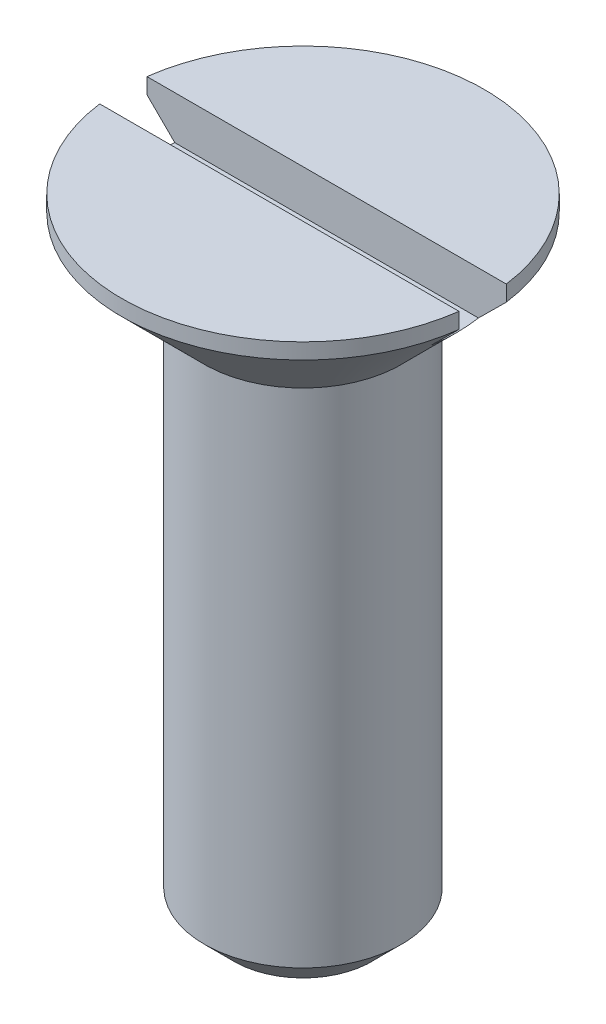
ISO-10303-21;
HEADER;
FILE_DESCRIPTION(('STEP AP214'),'2;1');
FILE_NAME('part.step','',(''),(''),'','','');
FILE_SCHEMA(('AUTOMOTIVE_DESIGN { 1 0 10303 214 1 1 1 1 }'));
ENDSEC;
DATA;
#1=APPLICATION_CONTEXT('core data for automotive mechanical design processes');
#2=APPLICATION_PROTOCOL_DEFINITION('international standard','automotive_design',2000,#1);
#3=PRODUCT_CONTEXT('',#1,'mechanical');
#4=PRODUCT('Part','Part','',(#3));
#5=PRODUCT_RELATED_PRODUCT_CATEGORY('part','',(#4));
#6=PRODUCT_DEFINITION_FORMATION('','',#4);
#7=PRODUCT_DEFINITION_CONTEXT('part definition',#1,'design');
#8=PRODUCT_DEFINITION('design','',#6,#7);
#9=PRODUCT_DEFINITION_SHAPE('','',#8);
#10=(LENGTH_UNIT() NAMED_UNIT(*) SI_UNIT(.MILLI.,.METRE.));
#11=(NAMED_UNIT(*) PLANE_ANGLE_UNIT() SI_UNIT($,.RADIAN.));
#12=(NAMED_UNIT(*) SI_UNIT($,.STERADIAN.) SOLID_ANGLE_UNIT());
#13=UNCERTAINTY_MEASURE_WITH_UNIT(LENGTH_MEASURE(1.E-05),#10,'distance_accuracy_value','');
#14=(GEOMETRIC_REPRESENTATION_CONTEXT(3) GLOBAL_UNCERTAINTY_ASSIGNED_CONTEXT((#13)) GLOBAL_UNIT_ASSIGNED_CONTEXT((#10,
#11,#12)) REPRESENTATION_CONTEXT('',''));
#15=CARTESIAN_POINT('',(0.,0.,0.));
#16=DIRECTION('',(0.,0.,1.));
#17=DIRECTION('',(1.,0.,0.));
#18=AXIS2_PLACEMENT_3D('',#15,#16,#17);
#19=CARTESIAN_POINT('',(0.,125.763182897862,0.));
#20=DIRECTION('',(0.,1.,0.));
#21=DIRECTION('',(-1.,0.,0.));
#22=AXIS2_PLACEMENT_3D('',#19,#20,#21);
#23=CYLINDRICAL_SURFACE('',#22,4.59999999999999);
#24=CARTESIAN_POINT('',(0.,15.6,0.));
#25=DIRECTION('',(0.,1.,0.));
#26=DIRECTION('',(-1.,0.,0.));
#27=AXIS2_PLACEMENT_3D('',#24,#25,#26);
#28=CIRCLE('',#27,4.59999999999999);
#29=CARTESIAN_POINT('',(4.56070170039654,15.6,-0.600000000000001));
#30=VERTEX_POINT('',#29);
#31=CARTESIAN_POINT('',(-4.56070170039655,15.6,-0.599999999999999));
#32=VERTEX_POINT('',#31);
#33=EDGE_CURVE('E101',#30,#32,#28,.T.);
#34=ORIENTED_EDGE('',*,*,#33,.T.);
#35=DIRECTION('',(0.,1.,0.));
#36=VECTOR('',#35,1.);
#37=CARTESIAN_POINT('',(-4.56070170039655,125.763182897862,-0.599999999999999));
#38=LINE('',#37,#36);
#39=CARTESIAN_POINT('',(-4.56070170039655,16.,-0.599999999999999));
#40=VERTEX_POINT('',#39);
#41=EDGE_CURVE('E52',#32,#40,#38,.T.);
#42=ORIENTED_EDGE('',*,*,#41,.T.);
#43=CARTESIAN_POINT('',(0.,16.,0.));
#44=DIRECTION('',(0.,1.,0.));
#45=DIRECTION('',(-1.,0.,0.));
#46=AXIS2_PLACEMENT_3D('',#43,#44,#45);
#47=CIRCLE('',#46,4.59999999999999);
#48=CARTESIAN_POINT('',(4.56070170039654,16.,-0.600000000000001));
#49=VERTEX_POINT('',#48);
#50=EDGE_CURVE('E102',#49,#40,#47,.T.);
#51=ORIENTED_EDGE('',*,*,#50,.F.);
#52=DIRECTION('',(0.,1.,0.));
#53=VECTOR('',#52,1.);
#54=CARTESIAN_POINT('',(4.56070170039653,125.763182897862,-0.600000000000001));
#55=LINE('',#54,#53);
#56=EDGE_CURVE('E138',#49,#30,#55,.F.);
#57=ORIENTED_EDGE('',*,*,#56,.T.);
#58=EDGE_LOOP('',(#34,#42,#51,#57));
#59=FACE_BOUND('',#58,.T.);
#60=ADVANCED_FACE('F29',(#59),#23,.T.);
#61=CARTESIAN_POINT('',(0.,16.,0.));
#62=DIRECTION('',(0.,-1.,0.));
#63=DIRECTION('',(1.,0.,0.));
#64=AXIS2_PLACEMENT_3D('',#61,#62,#63);
#65=PLANE('',#64);
#66=ORIENTED_EDGE('',*,*,#50,.T.);
#67=DIRECTION('',(1.,0.,0.));
#68=VECTOR('',#67,1.);
#69=CARTESIAN_POINT('',(0.,16.,-0.6));
#70=LINE('',#69,#68);
#71=EDGE_CURVE('E88',#40,#49,#70,.T.);
#72=ORIENTED_EDGE('',*,*,#71,.T.);
#73=EDGE_LOOP('',(#66,#72));
#74=FACE_BOUND('',#73,.T.);
#75=ADVANCED_FACE('F149',(#74),#65,.F.);
#76=CARTESIAN_POINT('',(2.49999999999999,0.,0.));
#77=DIRECTION('',(0.,1.,0.));
#78=DIRECTION('',(-1.,0.,0.));
#79=AXIS2_PLACEMENT_3D('',#76,#77,#78);
#80=PLANE('',#79);
#81=CARTESIAN_POINT('',(0.,0.,0.));
#82=DIRECTION('',(0.,1.,0.));
#83=DIRECTION('',(-1.,0.,0.));
#84=AXIS2_PLACEMENT_3D('',#81,#82,#83);
#85=CIRCLE('',#84,1.75);
#86=CARTESIAN_POINT('',(-1.75,0.,0.));
#87=VERTEX_POINT('',#86);
#88=EDGE_CURVE('E11',#87,#87,#85,.F.);
#89=ORIENTED_EDGE('',*,*,#88,.T.);
#90=EDGE_LOOP('',(#89));
#91=FACE_BOUND('',#90,.T.);
#92=ADVANCED_FACE('F31',(#91),#80,.F.);
#93=CARTESIAN_POINT('',(0.,125.763182897862,0.));
#94=DIRECTION('',(0.,1.,0.));
#95=DIRECTION('',(-1.,0.,0.));
#96=AXIS2_PLACEMENT_3D('',#93,#94,#95);
#97=CYLINDRICAL_SURFACE('',#96,2.5);
#98=CARTESIAN_POINT('',(0.,0.750000000000001,0.));
#99=DIRECTION('',(0.,1.,0.));
#100=DIRECTION('',(-1.,0.,0.));
#101=AXIS2_PLACEMENT_3D('',#98,#99,#100);
#102=CIRCLE('',#101,2.5);
#103=CARTESIAN_POINT('',(-2.5,0.75,0.));
#104=VERTEX_POINT('',#103);
#105=EDGE_CURVE('E37',#104,#104,#102,.T.);
#106=ORIENTED_EDGE('',*,*,#105,.T.);
#107=EDGE_LOOP('',(#106));
#108=FACE_BOUND('',#107,.T.);
#109=CARTESIAN_POINT('',(0.,13.5,0.));
#110=DIRECTION('',(0.,1.,0.));
#111=DIRECTION('',(-1.,0.,0.));
#112=AXIS2_PLACEMENT_3D('',#109,#110,#111);
#113=CIRCLE('',#112,2.50000000000001);
#114=CARTESIAN_POINT('',(-2.50000000000001,13.5,0.));
#115=VERTEX_POINT('',#114);
#116=EDGE_CURVE('E89',#115,#115,#113,.T.);
#117=ORIENTED_EDGE('',*,*,#116,.F.);
#118=EDGE_LOOP('',(#117));
#119=FACE_BOUND('',#118,.T.);
#120=ADVANCED_FACE('F157',(#108,#119),#97,.T.);
#121=CARTESIAN_POINT('',(0.,13.5,0.));
#122=DIRECTION('',(0.,1.,0.));
#123=DIRECTION('',(-1.,0.,0.));
#124=AXIS2_PLACEMENT_3D('',#121,#122,#123);
#125=CONICAL_SURFACE('',#124,2.50000000000001,0.785398163397447);
#126=ORIENTED_EDGE('',*,*,#33,.F.);
#127=CARTESIAN_POINT('',(10.1183814062173,21.1361552021309,-0.600000000000001));
#128=CARTESIAN_POINT('',(9.77237880412525,20.7907639678698,-0.600000000000001));
#129=CARTESIAN_POINT('',(9.42634955709613,20.4453994117717,-0.600000000000001));
#130=CARTESIAN_POINT('',(8.73419947980485,19.7547528216736,-0.600000000000001));
#131=CARTESIAN_POINT('',(8.38807864837897,19.4094707888397,-0.600000000000001));
#132=CARTESIAN_POINT('',(7.69561256912965,18.718924146203,-0.600000000000001));
#133=CARTESIAN_POINT('',(7.34926728513484,18.3736595726667,-0.600000000000001));
#134=CARTESIAN_POINT('',(6.6563976764415,17.6833191573215,-0.600000000000001));
#135=CARTESIAN_POINT('',(6.30987335413859,17.3382433131082,-0.600000000000001));
#136=CARTESIAN_POINT('',(5.60826287125322,16.6401526146392,-0.600000000000001));
#137=CARTESIAN_POINT('',(5.25316970822671,16.2871447944795,-0.600000000000001));
#138=CARTESIAN_POINT('',(4.72010881260147,15.7580428202624,-0.600000000000001));
#139=CARTESIAN_POINT('',(4.54234803292822,15.5817402037148,-0.600000000000001));
#140=CARTESIAN_POINT('',(4.18662953547045,15.2293351784177,-0.600000000000001));
#141=CARTESIAN_POINT('',(4.00867181849116,15.0532327688557,-0.6));
#142=CARTESIAN_POINT('',(3.6525022761017,14.701352230337,-0.6));
#143=CARTESIAN_POINT('',(3.47429050503802,14.5255740464114,-0.6));
#144=CARTESIAN_POINT('',(3.11741605694822,14.1744703862123,-0.6));
#145=CARTESIAN_POINT('',(2.93875337293157,13.9991449170436,-0.6));
#146=CARTESIAN_POINT('',(2.58070617190923,13.6492560667098,-0.6));
#147=CARTESIAN_POINT('',(2.40132170753325,13.4746926318479,-0.6));
#148=CARTESIAN_POINT('',(2.13120273030563,13.2139309745137,-0.6));
#149=CARTESIAN_POINT('',(2.04099050490045,13.1271920943271,-0.6));
#150=CARTESIAN_POINT('',(1.86005552948668,12.9542488475986,-0.6));
#151=CARTESIAN_POINT('',(1.76933278423142,12.8680444760957,-0.6));
#152=CARTESIAN_POINT('',(1.62900147259109,12.7359075445599,-0.6));
#153=CARTESIAN_POINT('',(1.57966840408974,12.6896825811889,-0.6));
#154=CARTESIAN_POINT('',(1.48070610854208,12.5975491044698,-0.6));
#155=CARTESIAN_POINT('',(1.4310768773385,12.5516405955834,-0.6));
#156=CARTESIAN_POINT('',(1.33153228050088,12.46033705431,-0.6));
#157=CARTESIAN_POINT('',(1.28161769843001,12.4149411699631,-0.6));
#158=CARTESIAN_POINT('',(1.18126809147799,12.3247315136374,-0.6));
#159=CARTESIAN_POINT('',(1.13083308164358,12.2799177249131,-0.6));
#160=CARTESIAN_POINT('',(1.01594428142606,12.1794732738619,-0.6));
#161=CARTESIAN_POINT('',(0.951277890986296,12.1240830119074,-0.6));
#162=CARTESIAN_POINT('',(0.852790765066552,12.0425536229012,-0.6));
#163=CARTESIAN_POINT('',(0.819653892619714,12.0155902104145,-0.6));
#164=CARTESIAN_POINT('',(0.752777223477812,11.962423847924,-0.6));
#165=CARTESIAN_POINT('',(0.719037476243011,11.9362208359951,-0.6));
#166=CARTESIAN_POINT('',(0.650481428458163,11.8846531263548,-0.6));
#167=CARTESIAN_POINT('',(0.615658548989345,11.8592971129547,-0.6));
#168=CARTESIAN_POINT('',(0.544903946043135,11.8101055648108,-0.6));
#169=CARTESIAN_POINT('',(0.508971381999,11.7862712268144,-0.6));
#170=CARTESIAN_POINT('',(0.435784053300708,11.741001775708,-0.6));
#171=CARTESIAN_POINT('',(0.398534766710509,11.7195579804391,-0.6));
#172=CARTESIAN_POINT('',(0.322227819580055,11.6802629799926,-0.6));
#173=CARTESIAN_POINT('',(0.283173497154302,11.6624054457945,-0.6));
#174=CARTESIAN_POINT('',(0.202020652551029,11.6319722294435,-0.6));
#175=CARTESIAN_POINT('',(0.159877310376877,11.6195075533814,-0.6));
#176=CARTESIAN_POINT('',(0.095575835234013,11.6072006100922,-0.6));
#177=CARTESIAN_POINT('',(0.0740249717194332,11.6041629570652,-0.6));
#178=CARTESIAN_POINT('',(0.0307182768822375,11.6003996804362,-0.6));
#179=CARTESIAN_POINT('',(0.00896247682933893,11.5996737096645,-0.6));
#180=CARTESIAN_POINT('',(-0.0345699639383316,11.6005994828782,-0.6));
#181=CARTESIAN_POINT('',(-0.0563464310543413,11.6022591862368,-0.6));
#182=CARTESIAN_POINT('',(-0.099615218549643,11.6078333863608,-0.6));
#183=CARTESIAN_POINT('',(-0.121107336978694,11.6117494060026,-0.6));
#184=CARTESIAN_POINT('',(-0.185134942209236,11.6265357002914,-0.6));
#185=CARTESIAN_POINT('',(-0.226969791715519,11.6404337391119,-0.6));
#186=CARTESIAN_POINT('',(-0.315586324599733,11.6765004944799,-0.6));
#187=CARTESIAN_POINT('',(-0.361919520428995,11.6997022215723,-0.6));
#188=CARTESIAN_POINT('',(-0.452224755648148,11.750411892372,-0.6));
#189=CARTESIAN_POINT('',(-0.496190701048898,11.7779302973096,-0.6));
#190=CARTESIAN_POINT('',(-0.582670192201262,11.8357427845373,-0.6));
#191=CARTESIAN_POINT('',(-0.625171506044444,11.8660548448864,-0.6));
#192=CARTESIAN_POINT('',(-0.708877631350633,11.9282938083187,-0.6));
#193=CARTESIAN_POINT('',(-0.750084003850104,11.9602186358005,-0.6));
#194=CARTESIAN_POINT('',(-0.837865316854152,12.0301502958333,-0.6));
#195=CARTESIAN_POINT('',(-0.884294486800737,12.0683390411683,-0.6));
#196=CARTESIAN_POINT('',(-0.976334289151169,12.1456933529096,-0.6));
#197=CARTESIAN_POINT('',(-1.02194484154762,12.1848590139103,-0.6));
#198=CARTESIAN_POINT('',(-1.15793123332395,12.3033810935371,-0.6));
#199=CARTESIAN_POINT('',(-1.24743229306662,12.3837383767021,-0.6));
#200=CARTESIAN_POINT('',(-1.42525155995861,12.5459781736001,-0.6));
#201=CARTESIAN_POINT('',(-1.513567986936,12.6278626184671,-0.6));
#202=CARTESIAN_POINT('',(-1.68936713658789,12.7924872764532,-0.6));
#203=CARTESIAN_POINT('',(-1.77685001626742,12.8752273220361,-0.6));
#204=CARTESIAN_POINT('',(-1.95074219272015,13.0407583256557,-0.6));
#205=CARTESIAN_POINT('',(-2.03715478318171,13.1235458325772,-0.6));
#206=CARTESIAN_POINT('',(-2.20961469118056,13.2895087748865,-0.6));
#207=CARTESIAN_POINT('',(-2.29566199027881,13.3726842294224,-0.6));
#208=CARTESIAN_POINT('',(-2.55328247225685,13.622494283962,-0.6));
#209=CARTESIAN_POINT('',(-2.72446181119684,13.7895347260563,-0.6));
#210=CARTESIAN_POINT('',(-3.19700560903384,14.2522405641196,-0.6));
#211=CARTESIAN_POINT('',(-3.49776123544566,14.5485265842328,-0.6));
#212=CARTESIAN_POINT('',(-4.09847548130351,15.1419098310141,-0.6));
#213=CARTESIAN_POINT('',(-4.3984340928013,15.4390070657126,-0.599999999999999));
#214=CARTESIAN_POINT('',(-4.99800686759838,16.0337487487246,-0.599999999999999));
#215=CARTESIAN_POINT('',(-5.29762088259544,16.3313933465327,-0.599999999999999));
#216=CARTESIAN_POINT('',(-5.89658396088358,16.9269467654743,-0.599999999999999));
#217=CARTESIAN_POINT('',(-6.19593302510777,17.2248555856697,-0.599999999999999));
#218=CARTESIAN_POINT('',(-6.79741034406437,17.8237831119427,-0.599999999999999));
#219=CARTESIAN_POINT('',(-7.09953690219864,18.1248035217329,-0.599999999999999));
#220=CARTESIAN_POINT('',(-7.70367180435057,18.7269636461719,-0.599999999999999));
#221=CARTESIAN_POINT('',(-8.00568014822724,19.028103360962,-0.599999999999999));
#222=CARTESIAN_POINT('',(-8.60950588895187,19.6303601651725,-0.599999999999999));
#223=CARTESIAN_POINT('',(-8.91132331553825,19.9314772247787,-0.599999999999999));
#224=CARTESIAN_POINT('',(-9.51489468647571,20.5337741912648,-0.599999999999999));
#225=CARTESIAN_POINT('',(-9.81664863090737,20.8349540980641,-0.599999999999999));
#226=CARTESIAN_POINT('',(-10.1183814062173,21.1361552021309,-0.599999999999999));
#227=B_SPLINE_CURVE_WITH_KNOTS('',3,(#127,#128,#129,#130,#131,#132,#133,#134,#135,#136,#137,
#138,#139,#140,#141,#142,#143,#144,#145,#146,#147,#148,#149,#150,#151,#152,#153,#154,#155,#156,
#157,#158,#159,#160,#161,#162,#163,#164,#165,#166,#167,#168,#169,#170,#171,#172,#173,#174,#175,
#176,#177,#178,#179,#180,#181,#182,#183,#184,#185,#186,#187,#188,#189,#190,#191,#192,#193,#194,
#195,#196,#197,#198,#199,#200,#201,#202,#203,#204,#205,#206,#207,#208,#209,#210,#211,#212,#213,
#214,#215,#216,#217,#218,#219,#220,#221,#222,#223,#224,#225,#226),.UNSPECIFIED.,.F.,.F.,(4,2,2,
2,2,2,2,2,2,2,2,2,2,2,2,2,2,2,2,2,2,2,2,2,2,2,2,2,2,2,2,2,2,2,2,2,2,2,2,2,2,2,2,2,2,2,2,2,2,4),
(0.,1.466668396456,2.93335642204373,4.4004842214473,5.867592873686,7.36970800027686,
8.12079614107717,8.87188122211627,9.62282443414827,10.3737793604996,11.1246804877892,
11.5001215583743,11.8755591390815,12.0783744793079,12.2811926731976,12.4835998979482,
12.6860012869499,12.9414034371595,13.0695584519761,13.197703000706,13.3269032063192,
13.4562038027617,13.5850183434978,13.7136035154946,13.8447223153937,13.9099048334339,
13.9750775618725,14.040468232761,14.1059030901692,14.2375157523495,14.3926020902521,
14.5480702492761,14.7046199715824,14.8609731099615,15.0413034803931,15.221651380438,
15.5824616874418,15.9437642015594,16.3049972599938,16.6640058405435,17.023032332519,
17.7405554623534,19.0071037148547,20.2736645509392,21.5406479401796,22.8076268494675,
24.0870968810828,25.3665684340811,26.6455864777222,27.9246028881098),.UNSPECIFIED.);
#228=CARTESIAN_POINT('',(3.85356977359954,14.9,-0.6));
#229=VERTEX_POINT('',#228);
#230=EDGE_CURVE('E132',#30,#229,#227,.T.);
#231=ORIENTED_EDGE('',*,*,#230,.T.);
#232=CARTESIAN_POINT('',(0.,14.9,0.));
#233=DIRECTION('',(0.,1.,0.));
#234=DIRECTION('',(0.,0.,1.));
#235=AXIS2_PLACEMENT_3D('',#232,#233,#234);
#236=CIRCLE('',#235,3.9);
#237=CARTESIAN_POINT('',(3.85356977359954,14.9,0.6));
#238=VERTEX_POINT('',#237);
#239=EDGE_CURVE('E116',#238,#229,#236,.T.);
#240=ORIENTED_EDGE('',*,*,#239,.F.);
#241=CARTESIAN_POINT('',(-10.1183814062173,21.1361552021309,0.600000000000001));
#242=CARTESIAN_POINT('',(-9.77237880412526,20.7907639678698,0.600000000000001));
#243=CARTESIAN_POINT('',(-9.42634955709613,20.4453994117717,0.600000000000001));
#244=CARTESIAN_POINT('',(-8.73419947980485,19.7547528216736,0.600000000000001));
#245=CARTESIAN_POINT('',(-8.38807864837897,19.4094707888397,0.600000000000001));
#246=CARTESIAN_POINT('',(-7.69561256912966,18.718924146203,0.600000000000001));
#247=CARTESIAN_POINT('',(-7.34926728513484,18.3736595726667,0.600000000000001));
#248=CARTESIAN_POINT('',(-6.6563976764415,17.6833191573215,0.600000000000001));
#249=CARTESIAN_POINT('',(-6.30987335413859,17.3382433131082,0.600000000000001));
#250=CARTESIAN_POINT('',(-5.60826287125322,16.6401526146392,0.600000000000001));
#251=CARTESIAN_POINT('',(-5.25316970822671,16.2871447944795,0.600000000000001));
#252=CARTESIAN_POINT('',(-4.72010881260148,15.7580428202624,0.600000000000001));
#253=CARTESIAN_POINT('',(-4.54234803292823,15.5817402037148,0.600000000000001));
#254=CARTESIAN_POINT('',(-4.18662953547046,15.2293351784178,0.600000000000001));
#255=CARTESIAN_POINT('',(-4.00867181849116,15.0532327688557,0.6));
#256=CARTESIAN_POINT('',(-3.6525022761017,14.701352230337,0.6));
#257=CARTESIAN_POINT('',(-3.47429050503803,14.5255740464114,0.6));
#258=CARTESIAN_POINT('',(-3.11741605694822,14.1744703862123,0.6));
#259=CARTESIAN_POINT('',(-2.93875337293157,13.9991449170436,0.6));
#260=CARTESIAN_POINT('',(-2.58070617190923,13.6492560667098,0.6));
#261=CARTESIAN_POINT('',(-2.40132170753326,13.4746926318479,0.6));
#262=CARTESIAN_POINT('',(-2.13120273030563,13.2139309745137,0.6));
#263=CARTESIAN_POINT('',(-2.04099050490045,13.1271920943271,0.6));
#264=CARTESIAN_POINT('',(-1.86005552948669,12.9542488475986,0.6));
#265=CARTESIAN_POINT('',(-1.76933278423143,12.8680444760957,0.6));
#266=CARTESIAN_POINT('',(-1.62900147259109,12.7359075445599,0.6));
#267=CARTESIAN_POINT('',(-1.57966840408975,12.6896825811889,0.6));
#268=CARTESIAN_POINT('',(-1.48070610854208,12.5975491044698,0.6));
#269=CARTESIAN_POINT('',(-1.4310768773385,12.5516405955834,0.6));
#270=CARTESIAN_POINT('',(-1.33153228050089,12.46033705431,0.6));
#271=CARTESIAN_POINT('',(-1.28161769843002,12.4149411699631,0.6));
#272=CARTESIAN_POINT('',(-1.18126809147799,12.3247315136374,0.6));
#273=CARTESIAN_POINT('',(-1.13083308164359,12.2799177249131,0.6));
#274=CARTESIAN_POINT('',(-1.01594428142607,12.1794732738619,0.6));
#275=CARTESIAN_POINT('',(-0.9512778909863,12.1240830119074,0.6));
#276=CARTESIAN_POINT('',(-0.852790765066556,12.0425536229012,0.6));
#277=CARTESIAN_POINT('',(-0.819653892619718,12.0155902104145,0.6));
#278=CARTESIAN_POINT('',(-0.752777223477816,11.962423847924,0.6));
#279=CARTESIAN_POINT('',(-0.719037476243014,11.9362208359951,0.6));
#280=CARTESIAN_POINT('',(-0.650481428458168,11.8846531263548,0.6));
#281=CARTESIAN_POINT('',(-0.615658548989352,11.8592971129547,0.6));
#282=CARTESIAN_POINT('',(-0.544903946043142,11.8101055648108,0.6));
#283=CARTESIAN_POINT('',(-0.508971381999007,11.7862712268145,0.6));
#284=CARTESIAN_POINT('',(-0.435784053300714,11.741001775708,0.6));
#285=CARTESIAN_POINT('',(-0.398534766710514,11.7195579804391,0.6));
#286=CARTESIAN_POINT('',(-0.322227819580059,11.6802629799926,0.6));
#287=CARTESIAN_POINT('',(-0.283173497154306,11.6624054457945,0.6));
#288=CARTESIAN_POINT('',(-0.202020652551033,11.6319722294435,0.6));
#289=CARTESIAN_POINT('',(-0.159877310376882,11.6195075533814,0.6));
#290=CARTESIAN_POINT('',(-0.0955758352340182,11.6072006100922,0.6));
#291=CARTESIAN_POINT('',(-0.0740249717194384,11.6041629570652,0.6));
#292=CARTESIAN_POINT('',(-0.0307182768822419,11.6003996804362,0.6));
#293=CARTESIAN_POINT('',(-0.00896247682934267,11.5996737096645,0.6));
#294=CARTESIAN_POINT('',(0.0345699639383285,11.6005994828782,0.6));
#295=CARTESIAN_POINT('',(0.0563464310543381,11.6022591862368,0.6));
#296=CARTESIAN_POINT('',(0.0996152185496401,11.6078333863608,0.6));
#297=CARTESIAN_POINT('',(0.121107336978691,11.6117494060026,0.6));
#298=CARTESIAN_POINT('',(0.185134942209233,11.6265357002914,0.6));
#299=CARTESIAN_POINT('',(0.226969791715517,11.6404337391119,0.6));
#300=CARTESIAN_POINT('',(0.31558632459973,11.6765004944799,0.6));
#301=CARTESIAN_POINT('',(0.361919520428992,11.6997022215723,0.6));
#302=CARTESIAN_POINT('',(0.452224755648145,11.750411892372,0.6));
#303=CARTESIAN_POINT('',(0.496190701048895,11.7779302973096,0.6));
#304=CARTESIAN_POINT('',(0.58267019220126,11.8357427845373,0.6));
#305=CARTESIAN_POINT('',(0.625171506044441,11.8660548448864,0.6));
#306=CARTESIAN_POINT('',(0.708877631350631,11.9282938083187,0.6));
#307=CARTESIAN_POINT('',(0.750084003850102,11.9602186358005,0.6));
#308=CARTESIAN_POINT('',(0.83786531685415,12.0301502958333,0.6));
#309=CARTESIAN_POINT('',(0.884294486800734,12.0683390411683,0.6));
#310=CARTESIAN_POINT('',(0.976334289151165,12.1456933529096,0.6));
#311=CARTESIAN_POINT('',(1.02194484154762,12.1848590139103,0.6));
#312=CARTESIAN_POINT('',(1.15793123332395,12.3033810935371,0.6));
#313=CARTESIAN_POINT('',(1.24743229306661,12.3837383767021,0.6));
#314=CARTESIAN_POINT('',(1.42525155995861,12.5459781736001,0.6));
#315=CARTESIAN_POINT('',(1.51356798693599,12.6278626184671,0.6));
#316=CARTESIAN_POINT('',(1.68936713658789,12.7924872764532,0.6));
#317=CARTESIAN_POINT('',(1.77685001626741,12.8752273220361,0.6));
#318=CARTESIAN_POINT('',(1.95074219272014,13.0407583256557,0.6));
#319=CARTESIAN_POINT('',(2.0371547831817,13.1235458325772,0.6));
#320=CARTESIAN_POINT('',(2.20961469118056,13.2895087748865,0.6));
#321=CARTESIAN_POINT('',(2.2956619902788,13.3726842294224,0.6));
#322=CARTESIAN_POINT('',(2.55328247225685,13.622494283962,0.6));
#323=CARTESIAN_POINT('',(2.72446181119683,13.7895347260563,0.6));
#324=CARTESIAN_POINT('',(3.19700560903383,14.2522405641196,0.6));
#325=CARTESIAN_POINT('',(3.49776123544566,14.5485265842328,0.6));
#326=CARTESIAN_POINT('',(4.0984754813035,15.1419098310141,0.6));
#327=CARTESIAN_POINT('',(4.39843409280129,15.4390070657126,0.599999999999999));
#328=CARTESIAN_POINT('',(4.99800686759838,16.0337487487246,0.599999999999999));
#329=CARTESIAN_POINT('',(5.29762088259543,16.3313933465327,0.599999999999999));
#330=CARTESIAN_POINT('',(5.89658396088358,16.9269467654743,0.599999999999999));
#331=CARTESIAN_POINT('',(6.19593302510776,17.2248555856697,0.599999999999999));
#332=CARTESIAN_POINT('',(6.79741034406437,17.8237831119427,0.599999999999999));
#333=CARTESIAN_POINT('',(7.09953690219864,18.1248035217329,0.599999999999999));
#334=CARTESIAN_POINT('',(7.70367180435057,18.7269636461719,0.599999999999999));
#335=CARTESIAN_POINT('',(8.00568014822723,19.028103360962,0.599999999999999));
#336=CARTESIAN_POINT('',(8.60950588895187,19.6303601651725,0.599999999999999));
#337=CARTESIAN_POINT('',(8.91132331553825,19.9314772247787,0.599999999999999));
#338=CARTESIAN_POINT('',(9.51489468647571,20.5337741912648,0.599999999999999));
#339=CARTESIAN_POINT('',(9.81664863090737,20.8349540980641,0.599999999999999));
#340=CARTESIAN_POINT('',(10.1183814062173,21.1361552021309,0.599999999999999));
#341=B_SPLINE_CURVE_WITH_KNOTS('',3,(#241,#242,#243,#244,#245,#246,#247,#248,#249,#250,#251,
#252,#253,#254,#255,#256,#257,#258,#259,#260,#261,#262,#263,#264,#265,#266,#267,#268,#269,#270,
#271,#272,#273,#274,#275,#276,#277,#278,#279,#280,#281,#282,#283,#284,#285,#286,#287,#288,#289,
#290,#291,#292,#293,#294,#295,#296,#297,#298,#299,#300,#301,#302,#303,#304,#305,#306,#307,#308,
#309,#310,#311,#312,#313,#314,#315,#316,#317,#318,#319,#320,#321,#322,#323,#324,#325,#326,#327,
#328,#329,#330,#331,#332,#333,#334,#335,#336,#337,#338,#339,#340),.UNSPECIFIED.,.F.,.F.,(4,2,2,
2,2,2,2,2,2,2,2,2,2,2,2,2,2,2,2,2,2,2,2,2,2,2,2,2,2,2,2,2,2,2,2,2,2,2,2,2,2,2,2,2,2,2,2,2,2,4),
(0.,1.466668396456,2.93335642204373,4.40048422144731,5.86759287368601,7.36970800027686,
8.12079614107717,8.87188122211628,9.62282443414828,10.3737793604996,11.1246804877892,
11.5001215583743,11.8755591390815,12.078374479308,12.2811926731976,12.4835998979482,
12.6860012869499,12.9414034371595,13.0695584519761,13.197703000706,13.3269032063192,
13.4562038027617,13.5850183434978,13.7136035154946,13.8447223153937,13.9099048334339,
13.9750775618725,14.040468232761,14.1059030901692,14.2375157523495,14.3926020902521,
14.5480702492761,14.7046199715824,14.8609731099615,15.0413034803931,15.221651380438,
15.5824616874418,15.9437642015594,16.3049972599938,16.6640058405435,17.023032332519,
17.7405554623534,19.0071037148547,20.2736645509392,21.5406479401796,22.8076268494675,
24.0870968810828,25.3665684340811,26.6455864777222,27.9246028881098),.UNSPECIFIED.);
#342=CARTESIAN_POINT('',(4.56070170039654,15.6,0.599999999999999));
#343=VERTEX_POINT('',#342);
#344=EDGE_CURVE('E97',#238,#343,#341,.T.);
#345=ORIENTED_EDGE('',*,*,#344,.T.);
#346=CARTESIAN_POINT('',(-4.56070170039655,15.6,0.600000000000001));
#347=VERTEX_POINT('',#346);
#348=EDGE_CURVE('E96',#347,#343,#28,.T.);
#349=ORIENTED_EDGE('',*,*,#348,.F.);
#350=CARTESIAN_POINT('',(-3.85356977359954,14.9,0.6));
#351=VERTEX_POINT('',#350);
#352=EDGE_CURVE('E98',#347,#351,#341,.T.);
#353=ORIENTED_EDGE('',*,*,#352,.T.);
#354=CARTESIAN_POINT('',(-3.85356977359954,14.9,-0.6));
#355=VERTEX_POINT('',#354);
#356=EDGE_CURVE('E115',#355,#351,#236,.T.);
#357=ORIENTED_EDGE('',*,*,#356,.F.);
#358=EDGE_CURVE('E107',#355,#32,#227,.T.);
#359=ORIENTED_EDGE('',*,*,#358,.T.);
#360=EDGE_LOOP('',(#126,#231,#240,#345,#349,#353,#357,#359));
#361=FACE_BOUND('',#360,.T.);
#362=ORIENTED_EDGE('',*,*,#116,.T.);
#363=EDGE_LOOP('',(#362));
#364=FACE_BOUND('',#363,.T.);
#365=ADVANCED_FACE('F136',(#361,#364),#125,.T.);
#366=ORIENTED_EDGE('',*,*,#348,.T.);
#367=DIRECTION('',(0.,1.,0.));
#368=VECTOR('',#367,1.);
#369=CARTESIAN_POINT('',(4.56070170039653,125.763182897862,0.599999999999999));
#370=LINE('',#369,#368);
#371=CARTESIAN_POINT('',(4.56070170039654,16.,0.599999999999999));
#372=VERTEX_POINT('',#371);
#373=EDGE_CURVE('E83',#343,#372,#370,.T.);
#374=ORIENTED_EDGE('',*,*,#373,.T.);
#375=CARTESIAN_POINT('',(-4.56070170039655,16.,0.600000000000001));
#376=VERTEX_POINT('',#375);
#377=EDGE_CURVE('E94',#376,#372,#47,.T.);
#378=ORIENTED_EDGE('',*,*,#377,.F.);
#379=DIRECTION('',(0.,1.,0.));
#380=VECTOR('',#379,1.);
#381=CARTESIAN_POINT('',(-4.56070170039655,125.763182897862,0.600000000000001));
#382=LINE('',#381,#380);
#383=EDGE_CURVE('E44',#376,#347,#382,.F.);
#384=ORIENTED_EDGE('',*,*,#383,.T.);
#385=EDGE_LOOP('',(#366,#374,#378,#384));
#386=FACE_BOUND('',#385,.T.);
#387=ADVANCED_FACE('F93',(#386),#23,.T.);
#388=ORIENTED_EDGE('',*,*,#377,.T.);
#389=DIRECTION('',(-1.,0.,0.));
#390=VECTOR('',#389,1.);
#391=CARTESIAN_POINT('',(0.,16.,0.6));
#392=LINE('',#391,#390);
#393=EDGE_CURVE('E79',#372,#376,#392,.T.);
#394=ORIENTED_EDGE('',*,*,#393,.T.);
#395=EDGE_LOOP('',(#388,#394));
#396=FACE_BOUND('',#395,.T.);
#397=ADVANCED_FACE('F100',(#396),#65,.F.);
#398=CARTESIAN_POINT('',(-4.6,14.9,0.600000000000001));
#399=DIRECTION('',(0.,1.,0.));
#400=DIRECTION('',(0.,0.,1.));
#401=AXIS2_PLACEMENT_3D('',#398,#399,#400);
#402=PLANE('',#401);
#403=ORIENTED_EDGE('',*,*,#239,.T.);
#404=DIRECTION('',(-1.,0.,0.));
#405=VECTOR('',#404,1.);
#406=CARTESIAN_POINT('',(-4.6,14.9,-0.599999999999999));
#407=LINE('',#406,#405);
#408=EDGE_CURVE('E126',#229,#355,#407,.T.);
#409=ORIENTED_EDGE('',*,*,#408,.T.);
#410=ORIENTED_EDGE('',*,*,#356,.T.);
#411=DIRECTION('',(1.,0.,0.));
#412=VECTOR('',#411,1.);
#413=CARTESIAN_POINT('',(-4.6,14.9,0.600000000000001));
#414=LINE('',#413,#412);
#415=EDGE_CURVE('E128',#351,#238,#414,.T.);
#416=ORIENTED_EDGE('',*,*,#415,.T.);
#417=EDGE_LOOP('',(#403,#409,#410,#416));
#418=FACE_BOUND('',#417,.T.);
#419=ADVANCED_FACE('F125',(#418),#402,.T.);
#420=CARTESIAN_POINT('',(-4.6,14.9,-0.599999999999999));
#421=DIRECTION('',(0.,0.,-1.));
#422=DIRECTION('',(-1.,0.,0.));
#423=AXIS2_PLACEMENT_3D('',#420,#421,#422);
#424=PLANE('',#423);
#425=ORIENTED_EDGE('',*,*,#408,.F.);
#426=ORIENTED_EDGE('',*,*,#230,.F.);
#427=ORIENTED_EDGE('',*,*,#56,.F.);
#428=ORIENTED_EDGE('',*,*,#71,.F.);
#429=ORIENTED_EDGE('',*,*,#41,.F.);
#430=ORIENTED_EDGE('',*,*,#358,.F.);
#431=EDGE_LOOP('',(#425,#426,#427,#428,#429,#430));
#432=FACE_BOUND('',#431,.T.);
#433=ADVANCED_FACE('F131',(#432),#424,.F.);
#434=CARTESIAN_POINT('',(-4.6,14.9,0.600000000000001));
#435=DIRECTION('',(0.,0.,1.));
#436=DIRECTION('',(1.,0.,0.));
#437=AXIS2_PLACEMENT_3D('',#434,#435,#436);
#438=PLANE('',#437);
#439=ORIENTED_EDGE('',*,*,#415,.F.);
#440=ORIENTED_EDGE('',*,*,#352,.F.);
#441=ORIENTED_EDGE('',*,*,#383,.F.);
#442=ORIENTED_EDGE('',*,*,#393,.F.);
#443=ORIENTED_EDGE('',*,*,#373,.F.);
#444=ORIENTED_EDGE('',*,*,#344,.F.);
#445=EDGE_LOOP('',(#439,#440,#441,#442,#443,#444));
#446=FACE_BOUND('',#445,.T.);
#447=ADVANCED_FACE('F82',(#446),#438,.F.);
#448=CARTESIAN_POINT('',(0.,0.750000000000001,0.));
#449=DIRECTION('',(0.,1.,0.));
#450=DIRECTION('',(-1.,0.,0.));
#451=AXIS2_PLACEMENT_3D('',#448,#449,#450);
#452=CONICAL_SURFACE('',#451,2.5,0.785398163397448);
#453=ORIENTED_EDGE('',*,*,#88,.F.);
#454=EDGE_LOOP('',(#453));
#455=FACE_BOUND('',#454,.T.);
#456=ORIENTED_EDGE('',*,*,#105,.F.);
#457=EDGE_LOOP('',(#456));
#458=FACE_BOUND('',#457,.T.);
#459=ADVANCED_FACE('F178',(#455,#458),#452,.T.);
#460=CLOSED_SHELL('',(#60,#75,#92,#120,#365,#387,#397,#419,#433,#447,#459));
#461=MANIFOLD_SOLID_BREP('B2',#460);
#462=ADVANCED_BREP_SHAPE_REPRESENTATION('',(#18,#461),#14);
#463=SHAPE_DEFINITION_REPRESENTATION(#9,#462);
ENDSEC;
END-ISO-10303-21;
